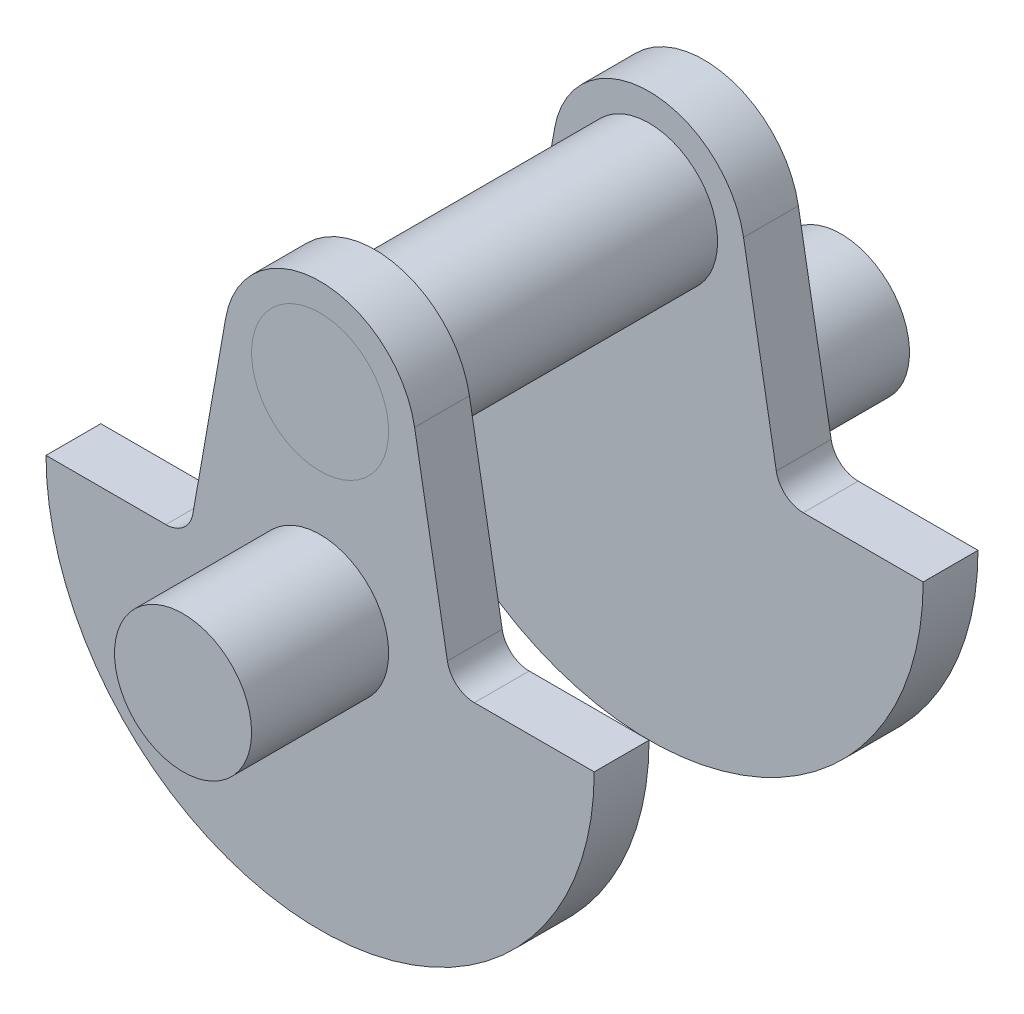
ISO-10303-21;
HEADER;
FILE_DESCRIPTION(('STEP AP214'),'2;1');
FILE_NAME('part.step','',(''),(''),'','','');
FILE_SCHEMA(('AUTOMOTIVE_DESIGN { 1 0 10303 214 1 1 1 1 }'));
ENDSEC;
DATA;
#1=APPLICATION_CONTEXT('core data for automotive mechanical design processes');
#2=APPLICATION_PROTOCOL_DEFINITION('international standard','automotive_design',2000,#1);
#3=PRODUCT_CONTEXT('',#1,'mechanical');
#4=PRODUCT('Part','Part','',(#3));
#5=PRODUCT_RELATED_PRODUCT_CATEGORY('part','',(#4));
#6=PRODUCT_DEFINITION_FORMATION('','',#4);
#7=PRODUCT_DEFINITION_CONTEXT('part definition',#1,'design');
#8=PRODUCT_DEFINITION('design','',#6,#7);
#9=PRODUCT_DEFINITION_SHAPE('','',#8);
#10=(LENGTH_UNIT() NAMED_UNIT(*) SI_UNIT(.MILLI.,.METRE.));
#11=(NAMED_UNIT(*) PLANE_ANGLE_UNIT() SI_UNIT($,.RADIAN.));
#12=(NAMED_UNIT(*) SI_UNIT($,.STERADIAN.) SOLID_ANGLE_UNIT());
#13=UNCERTAINTY_MEASURE_WITH_UNIT(LENGTH_MEASURE(1.E-05),#10,'distance_accuracy_value','');
#14=(GEOMETRIC_REPRESENTATION_CONTEXT(3) GLOBAL_UNCERTAINTY_ASSIGNED_CONTEXT((#13)) GLOBAL_UNIT_ASSIGNED_CONTEXT((#10,
#11,#12)) REPRESENTATION_CONTEXT('',''));
#15=CARTESIAN_POINT('',(0.,0.,0.));
#16=DIRECTION('',(0.,0.,1.));
#17=DIRECTION('',(1.,0.,0.));
#18=AXIS2_PLACEMENT_3D('',#15,#16,#17);
#19=CARTESIAN_POINT('',(0.,35.,10.));
#20=DIRECTION('',(0.,0.,-1.));
#21=DIRECTION('',(-1.,0.,0.));
#22=AXIS2_PLACEMENT_3D('',#19,#20,#21);
#23=CYLINDRICAL_SURFACE('',#22,12.5);
#24=CARTESIAN_POINT('',(0.,35.,10.));
#25=DIRECTION('',(0.,0.,1.));
#26=DIRECTION('',(1.,0.,0.));
#27=AXIS2_PLACEMENT_3D('',#24,#25,#26);
#28=CIRCLE('',#27,12.5);
#29=CARTESIAN_POINT('',(12.5,35.,10.));
#30=VERTEX_POINT('',#29);
#31=EDGE_CURVE('E12',#30,#30,#28,.T.);
#32=ORIENTED_EDGE('',*,*,#31,.F.);
#33=EDGE_LOOP('',(#32));
#34=FACE_BOUND('',#33,.T.);
#35=CARTESIAN_POINT('',(0.,35.,-50.));
#36=DIRECTION('',(0.,0.,1.));
#37=DIRECTION('',(1.,0.,0.));
#38=AXIS2_PLACEMENT_3D('',#35,#36,#37);
#39=CIRCLE('',#38,12.5);
#40=CARTESIAN_POINT('',(12.5,35.,-50.));
#41=VERTEX_POINT('',#40);
#42=EDGE_CURVE('E60',#41,#41,#39,.T.);
#43=ORIENTED_EDGE('',*,*,#42,.T.);
#44=EDGE_LOOP('',(#43));
#45=FACE_BOUND('',#44,.T.);
#46=ADVANCED_FACE('F51',(#34,#45),#23,.T.);
#47=CARTESIAN_POINT('',(0.,0.,10.));
#48=DIRECTION('',(0.,0.,1.));
#49=DIRECTION('',(1.,0.,0.));
#50=AXIS2_PLACEMENT_3D('',#47,#48,#49);
#51=PLANE('',#50);
#52=ORIENTED_EDGE('',*,*,#31,.T.);
#53=EDGE_LOOP('',(#52));
#54=FACE_BOUND('',#53,.T.);
#55=ADVANCED_FACE('F216',(#54),#51,.T.);
#56=CARTESIAN_POINT('',(-28.1369081886832,5.,-60.));
#57=DIRECTION('',(0.,0.,1.));
#58=DIRECTION('',(1.,0.,0.));
#59=AXIS2_PLACEMENT_3D('',#56,#57,#58);
#60=CYLINDRICAL_SURFACE('',#59,5.);
#61=CARTESIAN_POINT('',(-28.1369081886832,5.,-50.));
#62=DIRECTION('',(0.,0.,-1.));
#63=DIRECTION('',(-1.,0.,0.));
#64=AXIS2_PLACEMENT_3D('',#61,#62,#63);
#65=CIRCLE('',#64,5.);
#66=CARTESIAN_POINT('',(-23.2128694236222,4.13175911166538,-50.));
#67=VERTEX_POINT('',#66);
#68=CARTESIAN_POINT('',(-28.1369081886833,0.,-50.));
#69=VERTEX_POINT('',#68);
#70=EDGE_CURVE('E155',#67,#69,#65,.T.);
#71=ORIENTED_EDGE('',*,*,#70,.F.);
#72=DIRECTION('',(0.,0.,1.));
#73=VECTOR('',#72,1.);
#74=CARTESIAN_POINT('',(-23.2128694236222,4.13175911166538,-60.));
#75=LINE('',#74,#73);
#76=CARTESIAN_POINT('',(-23.2128694236222,4.13175911166538,-60.));
#77=VERTEX_POINT('',#76);
#78=EDGE_CURVE('E109',#77,#67,#75,.T.);
#79=ORIENTED_EDGE('',*,*,#78,.F.);
#80=CARTESIAN_POINT('',(-28.1369081886832,5.,-60.));
#81=DIRECTION('',(0.,0.,-1.));
#82=DIRECTION('',(-1.,0.,0.));
#83=AXIS2_PLACEMENT_3D('',#80,#81,#82);
#84=CIRCLE('',#83,5.);
#85=CARTESIAN_POINT('',(-28.1369081886833,0.,-60.));
#86=VERTEX_POINT('',#85);
#87=EDGE_CURVE('E181',#77,#86,#84,.T.);
#88=ORIENTED_EDGE('',*,*,#87,.T.);
#89=DIRECTION('',(0.,0.,1.));
#90=VECTOR('',#89,1.);
#91=CARTESIAN_POINT('',(-28.1369081886833,0.,-60.));
#92=LINE('',#91,#90);
#93=EDGE_CURVE('E104',#86,#69,#92,.T.);
#94=ORIENTED_EDGE('',*,*,#93,.T.);
#95=EDGE_LOOP('',(#71,#79,#88,#94));
#96=FACE_BOUND('',#95,.T.);
#97=ADVANCED_FACE('F213',(#96),#60,.F.);
#98=CARTESIAN_POINT('',(-23.2194881859129,4.0942222454179,-60.));
#99=DIRECTION('',(0.984807753012208,-0.173648177666931,0.));
#100=DIRECTION('',(0.173648177666931,0.984807753012208,0.));
#101=AXIS2_PLACEMENT_3D('',#98,#99,#100);
#102=PLANE('',#101);
#103=DIRECTION('',(0.173648177666931,0.984807753012208,0.));
#104=VECTOR('',#103,1.);
#105=CARTESIAN_POINT('',(-23.2194881859129,4.0942222454179,-50.));
#106=LINE('',#105,#104);
#107=CARTESIAN_POINT('',(-17.2341356777136,38.0388431091713,-50.));
#108=VERTEX_POINT('',#107);
#109=EDGE_CURVE('E159',#67,#108,#106,.T.);
#110=ORIENTED_EDGE('',*,*,#109,.T.);
#111=DIRECTION('',(0.,0.,1.));
#112=VECTOR('',#111,1.);
#113=CARTESIAN_POINT('',(-17.2341356777136,38.0388431091713,-60.));
#114=LINE('',#113,#112);
#115=CARTESIAN_POINT('',(-17.2341356777136,38.0388431091713,-60.));
#116=VERTEX_POINT('',#115);
#117=EDGE_CURVE('E195',#116,#108,#114,.T.);
#118=ORIENTED_EDGE('',*,*,#117,.F.);
#119=DIRECTION('',(0.173648177666931,0.984807753012208,0.));
#120=VECTOR('',#119,1.);
#121=CARTESIAN_POINT('',(-23.2194881859129,4.0942222454179,-60.));
#122=LINE('',#121,#120);
#123=EDGE_CURVE('E346',#77,#116,#122,.T.);
#124=ORIENTED_EDGE('',*,*,#123,.F.);
#125=ORIENTED_EDGE('',*,*,#78,.T.);
#126=EDGE_LOOP('',(#110,#118,#124,#125));
#127=FACE_BOUND('',#126,.T.);
#128=ADVANCED_FACE('F215',(#127),#102,.F.);
#129=CARTESIAN_POINT('',(0.,35.,-60.));
#130=DIRECTION('',(0.,0.,1.));
#131=DIRECTION('',(1.,0.,0.));
#132=AXIS2_PLACEMENT_3D('',#129,#130,#131);
#133=CYLINDRICAL_SURFACE('',#132,17.5);
#134=CARTESIAN_POINT('',(0.,35.,-50.));
#135=DIRECTION('',(0.,0.,-1.));
#136=DIRECTION('',(-1.,0.,0.));
#137=AXIS2_PLACEMENT_3D('',#134,#135,#136);
#138=CIRCLE('',#137,17.5);
#139=CARTESIAN_POINT('',(17.2341356777136,38.0388431091713,-50.));
#140=VERTEX_POINT('',#139);
#141=EDGE_CURVE('E163',#108,#140,#138,.T.);
#142=ORIENTED_EDGE('',*,*,#141,.T.);
#143=DIRECTION('',(0.,0.,1.));
#144=VECTOR('',#143,1.);
#145=CARTESIAN_POINT('',(17.2341356777136,38.0388431091713,-60.));
#146=LINE('',#145,#144);
#147=CARTESIAN_POINT('',(17.2341356777136,38.0388431091713,-60.));
#148=VERTEX_POINT('',#147);
#149=EDGE_CURVE('E191',#148,#140,#146,.T.);
#150=ORIENTED_EDGE('',*,*,#149,.F.);
#151=CARTESIAN_POINT('',(0.,35.,-60.));
#152=DIRECTION('',(0.,0.,-1.));
#153=DIRECTION('',(-1.,0.,0.));
#154=AXIS2_PLACEMENT_3D('',#151,#152,#153);
#155=CIRCLE('',#154,17.5);
#156=EDGE_CURVE('E349',#116,#148,#155,.T.);
#157=ORIENTED_EDGE('',*,*,#156,.F.);
#158=ORIENTED_EDGE('',*,*,#117,.T.);
#159=EDGE_LOOP('',(#142,#150,#157,#158));
#160=FACE_BOUND('',#159,.T.);
#161=ADVANCED_FACE('F222',(#160),#133,.T.);
#162=CARTESIAN_POINT('',(23.2194881859129,4.0942222454179,-60.));
#163=DIRECTION('',(-0.984807753012208,-0.173648177666931,0.));
#164=DIRECTION('',(0.173648177666931,-0.984807753012208,0.));
#165=AXIS2_PLACEMENT_3D('',#162,#163,#164);
#166=PLANE('',#165);
#167=DIRECTION('',(0.173648177666931,-0.984807753012208,0.));
#168=VECTOR('',#167,1.);
#169=CARTESIAN_POINT('',(23.2194881859129,4.0942222454179,-50.));
#170=LINE('',#169,#168);
#171=CARTESIAN_POINT('',(23.2128694236222,4.13175911166537,-50.));
#172=VERTEX_POINT('',#171);
#173=EDGE_CURVE('E166',#140,#172,#170,.T.);
#174=ORIENTED_EDGE('',*,*,#173,.T.);
#175=DIRECTION('',(0.,0.,1.));
#176=VECTOR('',#175,1.);
#177=CARTESIAN_POINT('',(23.2128694236222,4.13175911166537,-60.));
#178=LINE('',#177,#176);
#179=CARTESIAN_POINT('',(23.2128694236222,4.13175911166537,-60.));
#180=VERTEX_POINT('',#179);
#181=EDGE_CURVE('E188',#180,#172,#178,.T.);
#182=ORIENTED_EDGE('',*,*,#181,.F.);
#183=DIRECTION('',(0.173648177666931,-0.984807753012208,0.));
#184=VECTOR('',#183,1.);
#185=CARTESIAN_POINT('',(23.2194881859129,4.0942222454179,-60.));
#186=LINE('',#185,#184);
#187=EDGE_CURVE('E352',#148,#180,#186,.T.);
#188=ORIENTED_EDGE('',*,*,#187,.F.);
#189=ORIENTED_EDGE('',*,*,#149,.T.);
#190=EDGE_LOOP('',(#174,#182,#188,#189));
#191=FACE_BOUND('',#190,.T.);
#192=ADVANCED_FACE('F254',(#191),#166,.F.);
#193=CARTESIAN_POINT('',(28.1369081886832,5.,-60.));
#194=DIRECTION('',(0.,0.,1.));
#195=DIRECTION('',(1.,0.,0.));
#196=AXIS2_PLACEMENT_3D('',#193,#194,#195);
#197=CYLINDRICAL_SURFACE('',#196,5.);
#198=CARTESIAN_POINT('',(28.1369081886832,5.,-50.));
#199=DIRECTION('',(0.,0.,-1.));
#200=DIRECTION('',(-1.,0.,0.));
#201=AXIS2_PLACEMENT_3D('',#198,#199,#200);
#202=CIRCLE('',#201,5.);
#203=CARTESIAN_POINT('',(28.1369081886833,0.,-50.));
#204=VERTEX_POINT('',#203);
#205=EDGE_CURVE('E170',#204,#172,#202,.T.);
#206=ORIENTED_EDGE('',*,*,#205,.F.);
#207=DIRECTION('',(0.,0.,1.));
#208=VECTOR('',#207,1.);
#209=CARTESIAN_POINT('',(28.1369081886833,0.,-60.));
#210=LINE('',#209,#208);
#211=CARTESIAN_POINT('',(28.1369081886833,0.,-60.));
#212=VERTEX_POINT('',#211);
#213=EDGE_CURVE('E141',#212,#204,#210,.T.);
#214=ORIENTED_EDGE('',*,*,#213,.F.);
#215=CARTESIAN_POINT('',(28.1369081886832,5.,-60.));
#216=DIRECTION('',(0.,0.,-1.));
#217=DIRECTION('',(-1.,0.,0.));
#218=AXIS2_PLACEMENT_3D('',#215,#216,#217);
#219=CIRCLE('',#218,5.);
#220=EDGE_CURVE('E132',#212,#180,#219,.T.);
#221=ORIENTED_EDGE('',*,*,#220,.T.);
#222=ORIENTED_EDGE('',*,*,#181,.T.);
#223=EDGE_LOOP('',(#206,#214,#221,#222));
#224=FACE_BOUND('',#223,.T.);
#225=ADVANCED_FACE('F264',(#224),#197,.F.);
#226=CARTESIAN_POINT('',(0.,0.,-60.));
#227=DIRECTION('',(0.,-1.,0.));
#228=DIRECTION('',(0.,0.,-1.));
#229=AXIS2_PLACEMENT_3D('',#226,#227,#228);
#230=PLANE('',#229);
#231=DIRECTION('',(1.,0.,0.));
#232=VECTOR('',#231,1.);
#233=CARTESIAN_POINT('',(0.,0.,-50.));
#234=LINE('',#233,#232);
#235=CARTESIAN_POINT('',(50.,0.,-50.));
#236=VERTEX_POINT('',#235);
#237=EDGE_CURVE('E139',#204,#236,#234,.T.);
#238=ORIENTED_EDGE('',*,*,#237,.T.);
#239=DIRECTION('',(0.,0.,1.));
#240=VECTOR('',#239,1.);
#241=CARTESIAN_POINT('',(50.,0.,-60.));
#242=LINE('',#241,#240);
#243=CARTESIAN_POINT('',(50.,0.,-60.));
#244=VERTEX_POINT('',#243);
#245=EDGE_CURVE('E136',#244,#236,#242,.T.);
#246=ORIENTED_EDGE('',*,*,#245,.F.);
#247=DIRECTION('',(1.,0.,0.));
#248=VECTOR('',#247,1.);
#249=CARTESIAN_POINT('',(0.,0.,-60.));
#250=LINE('',#249,#248);
#251=EDGE_CURVE('E125',#212,#244,#250,.T.);
#252=ORIENTED_EDGE('',*,*,#251,.F.);
#253=ORIENTED_EDGE('',*,*,#213,.T.);
#254=EDGE_LOOP('',(#238,#246,#252,#253));
#255=FACE_BOUND('',#254,.T.);
#256=ADVANCED_FACE('F137',(#255),#230,.F.);
#257=CARTESIAN_POINT('',(0.,0.,-60.));
#258=DIRECTION('',(0.,0.,1.));
#259=DIRECTION('',(1.,0.,0.));
#260=AXIS2_PLACEMENT_3D('',#257,#258,#259);
#261=CYLINDRICAL_SURFACE('',#260,50.);
#262=CARTESIAN_POINT('',(0.,0.,-50.));
#263=DIRECTION('',(0.,0.,-1.));
#264=DIRECTION('',(-1.,0.,0.));
#265=AXIS2_PLACEMENT_3D('',#262,#263,#264);
#266=CIRCLE('',#265,50.);
#267=CARTESIAN_POINT('',(-50.,0.,-50.));
#268=VERTEX_POINT('',#267);
#269=EDGE_CURVE('E97',#236,#268,#266,.T.);
#270=ORIENTED_EDGE('',*,*,#269,.T.);
#271=DIRECTION('',(0.,0.,1.));
#272=VECTOR('',#271,1.);
#273=CARTESIAN_POINT('',(-50.,0.,-60.));
#274=LINE('',#273,#272);
#275=CARTESIAN_POINT('',(-50.,0.,-60.));
#276=VERTEX_POINT('',#275);
#277=EDGE_CURVE('E142',#276,#268,#274,.T.);
#278=ORIENTED_EDGE('',*,*,#277,.F.);
#279=CARTESIAN_POINT('',(0.,0.,-60.));
#280=DIRECTION('',(0.,0.,-1.));
#281=DIRECTION('',(-1.,0.,0.));
#282=AXIS2_PLACEMENT_3D('',#279,#280,#281);
#283=CIRCLE('',#282,50.);
#284=EDGE_CURVE('E130',#244,#276,#283,.T.);
#285=ORIENTED_EDGE('',*,*,#284,.F.);
#286=ORIENTED_EDGE('',*,*,#245,.T.);
#287=EDGE_LOOP('',(#270,#278,#285,#286));
#288=FACE_BOUND('',#287,.T.);
#289=ADVANCED_FACE('F144',(#288),#261,.T.);
#290=CARTESIAN_POINT('',(0.,0.,-60.));
#291=DIRECTION('',(0.,-1.,0.));
#292=DIRECTION('',(1.,0.,0.));
#293=AXIS2_PLACEMENT_3D('',#290,#291,#292);
#294=PLANE('',#293);
#295=DIRECTION('',(1.,0.,0.));
#296=VECTOR('',#295,1.);
#297=CARTESIAN_POINT('',(0.,0.,-50.));
#298=LINE('',#297,#296);
#299=EDGE_CURVE('E178',#268,#69,#298,.T.);
#300=ORIENTED_EDGE('',*,*,#299,.T.);
#301=ORIENTED_EDGE('',*,*,#93,.F.);
#302=DIRECTION('',(1.,0.,0.));
#303=VECTOR('',#302,1.);
#304=CARTESIAN_POINT('',(0.,0.,-60.));
#305=LINE('',#304,#303);
#306=EDGE_CURVE('E68',#276,#86,#305,.T.);
#307=ORIENTED_EDGE('',*,*,#306,.F.);
#308=ORIENTED_EDGE('',*,*,#277,.T.);
#309=EDGE_LOOP('',(#300,#301,#307,#308));
#310=FACE_BOUND('',#309,.T.);
#311=ADVANCED_FACE('F291',(#310),#294,.F.);
#312=CARTESIAN_POINT('',(0.,0.,-60.));
#313=DIRECTION('',(0.,0.,-1.));
#314=DIRECTION('',(-1.,0.,0.));
#315=AXIS2_PLACEMENT_3D('',#312,#313,#314);
#316=PLANE('',#315);
#317=ORIENTED_EDGE('',*,*,#87,.F.);
#318=ORIENTED_EDGE('',*,*,#123,.T.);
#319=ORIENTED_EDGE('',*,*,#156,.T.);
#320=ORIENTED_EDGE('',*,*,#187,.T.);
#321=ORIENTED_EDGE('',*,*,#220,.F.);
#322=ORIENTED_EDGE('',*,*,#251,.T.);
#323=ORIENTED_EDGE('',*,*,#284,.T.);
#324=ORIENTED_EDGE('',*,*,#306,.T.);
#325=EDGE_LOOP('',(#317,#318,#319,#320,#321,#322,#323,#324));
#326=FACE_BOUND('',#325,.T.);
#327=CARTESIAN_POINT('',(0.,0.,-60.));
#328=DIRECTION('',(0.,0.,-1.));
#329=DIRECTION('',(-1.,0.,0.));
#330=AXIS2_PLACEMENT_3D('',#327,#328,#329);
#331=CIRCLE('',#330,12.5);
#332=CARTESIAN_POINT('',(-12.5,0.,-60.));
#333=VERTEX_POINT('',#332);
#334=EDGE_CURVE('E148',#333,#333,#331,.T.);
#335=ORIENTED_EDGE('',*,*,#334,.F.);
#336=EDGE_LOOP('',(#335));
#337=FACE_BOUND('',#336,.T.);
#338=ADVANCED_FACE('F127',(#326,#337),#316,.T.);
#339=CARTESIAN_POINT('',(0.,0.,-50.));
#340=DIRECTION('',(0.,0.,-1.));
#341=DIRECTION('',(-1.,0.,0.));
#342=AXIS2_PLACEMENT_3D('',#339,#340,#341);
#343=PLANE('',#342);
#344=ORIENTED_EDGE('',*,*,#42,.F.);
#345=EDGE_LOOP('',(#344));
#346=FACE_BOUND('',#345,.T.);
#347=ORIENTED_EDGE('',*,*,#70,.T.);
#348=ORIENTED_EDGE('',*,*,#299,.F.);
#349=ORIENTED_EDGE('',*,*,#269,.F.);
#350=ORIENTED_EDGE('',*,*,#237,.F.);
#351=ORIENTED_EDGE('',*,*,#205,.T.);
#352=ORIENTED_EDGE('',*,*,#173,.F.);
#353=ORIENTED_EDGE('',*,*,#141,.F.);
#354=ORIENTED_EDGE('',*,*,#109,.F.);
#355=EDGE_LOOP('',(#347,#348,#349,#350,#351,#352,#353,#354));
#356=FACE_BOUND('',#355,.T.);
#357=ADVANCED_FACE('F205',(#346,#356),#343,.F.);
#358=CARTESIAN_POINT('',(0.,0.,-85.));
#359=DIRECTION('',(0.,0.,1.));
#360=DIRECTION('',(1.,0.,0.));
#361=AXIS2_PLACEMENT_3D('',#358,#359,#360);
#362=CYLINDRICAL_SURFACE('',#361,12.5);
#363=ORIENTED_EDGE('',*,*,#334,.T.);
#364=EDGE_LOOP('',(#363));
#365=FACE_BOUND('',#364,.T.);
#366=CARTESIAN_POINT('',(0.,0.,-85.));
#367=DIRECTION('',(0.,0.,-1.));
#368=DIRECTION('',(-1.,0.,0.));
#369=AXIS2_PLACEMENT_3D('',#366,#367,#368);
#370=CIRCLE('',#369,12.5);
#371=CARTESIAN_POINT('',(-12.5,0.,-85.));
#372=VERTEX_POINT('',#371);
#373=EDGE_CURVE('E160',#372,#372,#370,.T.);
#374=ORIENTED_EDGE('',*,*,#373,.F.);
#375=EDGE_LOOP('',(#374));
#376=FACE_BOUND('',#375,.T.);
#377=ADVANCED_FACE('F208',(#365,#376),#362,.T.);
#378=CARTESIAN_POINT('',(0.,0.,-85.));
#379=DIRECTION('',(0.,0.,-1.));
#380=DIRECTION('',(-1.,0.,0.));
#381=AXIS2_PLACEMENT_3D('',#378,#379,#380);
#382=PLANE('',#381);
#383=ORIENTED_EDGE('',*,*,#373,.T.);
#384=EDGE_LOOP('',(#383));
#385=FACE_BOUND('',#384,.T.);
#386=ADVANCED_FACE('F324',(#385),#382,.T.);
#387=CLOSED_SHELL('',(#46,#55,#97,#128,#161,#192,#225,#256,#289,#311,#338,#357,#377,#386));
#388=MANIFOLD_SOLID_BREP('B2',#387);
#389=CARTESIAN_POINT('',(0.,0.,10.));
#390=DIRECTION('',(0.,0.,1.));
#391=DIRECTION('',(1.,0.,0.));
#392=AXIS2_PLACEMENT_3D('',#389,#390,#391);
#393=PLANE('',#392);
#394=CARTESIAN_POINT('',(0.,0.,10.));
#395=DIRECTION('',(0.,0.,1.));
#396=DIRECTION('',(1.,0.,0.));
#397=AXIS2_PLACEMENT_3D('',#394,#395,#396);
#398=CIRCLE('',#397,12.5);
#399=CARTESIAN_POINT('',(12.5,0.,10.));
#400=VERTEX_POINT('',#399);
#401=EDGE_CURVE('E471',#400,#400,#398,.T.);
#402=ORIENTED_EDGE('',*,*,#401,.F.);
#403=EDGE_LOOP('',(#402));
#404=FACE_BOUND('',#403,.T.);
#405=CARTESIAN_POINT('',(0.,0.,10.));
#406=DIRECTION('',(0.,0.,1.));
#407=DIRECTION('',(1.,0.,0.));
#408=AXIS2_PLACEMENT_3D('',#405,#406,#407);
#409=CIRCLE('',#408,50.);
#410=CARTESIAN_POINT('',(-50.,0.,10.));
#411=VERTEX_POINT('',#410);
#412=CARTESIAN_POINT('',(50.,0.,10.));
#413=VERTEX_POINT('',#412);
#414=EDGE_CURVE('E482',#411,#413,#409,.T.);
#415=ORIENTED_EDGE('',*,*,#414,.T.);
#416=DIRECTION('',(-1.,0.,0.));
#417=VECTOR('',#416,1.);
#418=CARTESIAN_POINT('',(50.,0.,10.));
#419=LINE('',#418,#417);
#420=CARTESIAN_POINT('',(28.1369081886833,0.,10.));
#421=VERTEX_POINT('',#420);
#422=EDGE_CURVE('E430',#413,#421,#419,.T.);
#423=ORIENTED_EDGE('',*,*,#422,.T.);
#424=CARTESIAN_POINT('',(28.1369081886832,5.,10.));
#425=DIRECTION('',(0.,0.,-1.));
#426=DIRECTION('',(-1.,0.,0.));
#427=AXIS2_PLACEMENT_3D('',#424,#425,#426);
#428=CIRCLE('',#427,5.);
#429=CARTESIAN_POINT('',(23.2128694236222,4.13175911166537,10.));
#430=VERTEX_POINT('',#429);
#431=EDGE_CURVE('E497',#421,#430,#428,.T.);
#432=ORIENTED_EDGE('',*,*,#431,.T.);
#433=DIRECTION('',(-0.173648177666931,0.984807753012208,0.));
#434=VECTOR('',#433,1.);
#435=CARTESIAN_POINT('',(23.2128694236222,4.13175911166537,10.));
#436=LINE('',#435,#434);
#437=CARTESIAN_POINT('',(17.2341356777136,38.0388431091713,10.));
#438=VERTEX_POINT('',#437);
#439=EDGE_CURVE('E510',#430,#438,#436,.T.);
#440=ORIENTED_EDGE('',*,*,#439,.T.);
#441=CARTESIAN_POINT('',(0.,35.,10.));
#442=DIRECTION('',(0.,0.,1.));
#443=DIRECTION('',(1.,0.,0.));
#444=AXIS2_PLACEMENT_3D('',#441,#442,#443);
#445=CIRCLE('',#444,17.5);
#446=CARTESIAN_POINT('',(-17.2341356777136,38.0388431091713,10.));
#447=VERTEX_POINT('',#446);
#448=EDGE_CURVE('E449',#438,#447,#445,.T.);
#449=ORIENTED_EDGE('',*,*,#448,.T.);
#450=DIRECTION('',(-0.173648177666931,-0.984807753012208,0.));
#451=VECTOR('',#450,1.);
#452=CARTESIAN_POINT('',(-23.2128694236222,4.13175911166537,10.));
#453=LINE('',#452,#451);
#454=CARTESIAN_POINT('',(-23.2128694236222,4.13175911166537,10.));
#455=VERTEX_POINT('',#454);
#456=EDGE_CURVE('E443',#447,#455,#453,.T.);
#457=ORIENTED_EDGE('',*,*,#456,.T.);
#458=CARTESIAN_POINT('',(-28.1369081886832,5.,10.));
#459=DIRECTION('',(0.,0.,-1.));
#460=DIRECTION('',(1.,0.,0.));
#461=AXIS2_PLACEMENT_3D('',#458,#459,#460);
#462=CIRCLE('',#461,5.);
#463=CARTESIAN_POINT('',(-28.1369081886833,0.,10.));
#464=VERTEX_POINT('',#463);
#465=EDGE_CURVE('E447',#455,#464,#462,.T.);
#466=ORIENTED_EDGE('',*,*,#465,.T.);
#467=DIRECTION('',(-1.,0.,0.));
#468=VECTOR('',#467,1.);
#469=CARTESIAN_POINT('',(-50.,0.,10.));
#470=LINE('',#469,#468);
#471=EDGE_CURVE('E387',#464,#411,#470,.T.);
#472=ORIENTED_EDGE('',*,*,#471,.T.);
#473=EDGE_LOOP('',(#415,#423,#432,#440,#449,#457,#466,#472));
#474=FACE_BOUND('',#473,.T.);
#475=CARTESIAN_POINT('',(0.,35.,10.));
#476=DIRECTION('',(0.,0.,1.));
#477=DIRECTION('',(1.,0.,0.));
#478=AXIS2_PLACEMENT_3D('',#475,#476,#477);
#479=CIRCLE('',#478,12.5);
#480=CARTESIAN_POINT('',(12.5,35.,10.));
#481=VERTEX_POINT('',#480);
#482=EDGE_CURVE('E518',#481,#481,#479,.T.);
#483=ORIENTED_EDGE('',*,*,#482,.F.);
#484=EDGE_LOOP('',(#483));
#485=FACE_BOUND('',#484,.T.);
#486=ADVANCED_FACE('F370',(#404,#474,#485),#393,.T.);
#487=CARTESIAN_POINT('',(0.,0.,0.));
#488=DIRECTION('',(0.,0.,1.));
#489=DIRECTION('',(1.,0.,0.));
#490=AXIS2_PLACEMENT_3D('',#487,#488,#489);
#491=PLANE('',#490);
#492=CARTESIAN_POINT('',(0.,0.,0.));
#493=DIRECTION('',(0.,0.,1.));
#494=DIRECTION('',(1.,0.,0.));
#495=AXIS2_PLACEMENT_3D('',#492,#493,#494);
#496=CIRCLE('',#495,50.);
#497=CARTESIAN_POINT('',(-50.,0.,0.));
#498=VERTEX_POINT('',#497);
#499=CARTESIAN_POINT('',(50.,0.,0.));
#500=VERTEX_POINT('',#499);
#501=EDGE_CURVE('E467',#498,#500,#496,.T.);
#502=ORIENTED_EDGE('',*,*,#501,.F.);
#503=DIRECTION('',(-1.,0.,0.));
#504=VECTOR('',#503,1.);
#505=CARTESIAN_POINT('',(-50.,0.,0.));
#506=LINE('',#505,#504);
#507=CARTESIAN_POINT('',(-28.1369081886833,0.,0.));
#508=VERTEX_POINT('',#507);
#509=EDGE_CURVE('E422',#508,#498,#506,.T.);
#510=ORIENTED_EDGE('',*,*,#509,.F.);
#511=CARTESIAN_POINT('',(-28.1369081886832,5.,0.));
#512=DIRECTION('',(0.,0.,-1.));
#513=DIRECTION('',(1.,0.,0.));
#514=AXIS2_PLACEMENT_3D('',#511,#512,#513);
#515=CIRCLE('',#514,5.);
#516=CARTESIAN_POINT('',(-23.2128694236222,4.13175911166537,0.));
#517=VERTEX_POINT('',#516);
#518=EDGE_CURVE('E416',#517,#508,#515,.T.);
#519=ORIENTED_EDGE('',*,*,#518,.F.);
#520=DIRECTION('',(-0.173648177666931,-0.984807753012208,0.));
#521=VECTOR('',#520,1.);
#522=CARTESIAN_POINT('',(-23.2128694236222,4.13175911166537,0.));
#523=LINE('',#522,#521);
#524=CARTESIAN_POINT('',(-17.2341356777136,38.0388431091713,0.));
#525=VERTEX_POINT('',#524);
#526=EDGE_CURVE('E457',#525,#517,#523,.T.);
#527=ORIENTED_EDGE('',*,*,#526,.F.);
#528=CARTESIAN_POINT('',(0.,35.,0.));
#529=DIRECTION('',(0.,0.,1.));
#530=DIRECTION('',(1.,0.,0.));
#531=AXIS2_PLACEMENT_3D('',#528,#529,#530);
#532=CIRCLE('',#531,17.5);
#533=CARTESIAN_POINT('',(17.2341356777136,38.0388431091713,0.));
#534=VERTEX_POINT('',#533);
#535=EDGE_CURVE('E477',#534,#525,#532,.T.);
#536=ORIENTED_EDGE('',*,*,#535,.F.);
#537=DIRECTION('',(-0.173648177666931,0.984807753012208,0.));
#538=VECTOR('',#537,1.);
#539=CARTESIAN_POINT('',(23.2128694236222,4.13175911166537,0.));
#540=LINE('',#539,#538);
#541=CARTESIAN_POINT('',(23.2128694236222,4.13175911166537,0.));
#542=VERTEX_POINT('',#541);
#543=EDGE_CURVE('E475',#542,#534,#540,.T.);
#544=ORIENTED_EDGE('',*,*,#543,.F.);
#545=CARTESIAN_POINT('',(28.1369081886832,5.,0.));
#546=DIRECTION('',(0.,0.,-1.));
#547=DIRECTION('',(-1.,0.,0.));
#548=AXIS2_PLACEMENT_3D('',#545,#546,#547);
#549=CIRCLE('',#548,5.);
#550=CARTESIAN_POINT('',(28.1369081886833,0.,0.));
#551=VERTEX_POINT('',#550);
#552=EDGE_CURVE('E473',#551,#542,#549,.T.);
#553=ORIENTED_EDGE('',*,*,#552,.F.);
#554=DIRECTION('',(-1.,0.,0.));
#555=VECTOR('',#554,1.);
#556=CARTESIAN_POINT('',(50.,0.,0.));
#557=LINE('',#556,#555);
#558=EDGE_CURVE('E470',#500,#551,#557,.T.);
#559=ORIENTED_EDGE('',*,*,#558,.F.);
#560=EDGE_LOOP('',(#502,#510,#519,#527,#536,#544,#553,#559));
#561=FACE_BOUND('',#560,.T.);
#562=CARTESIAN_POINT('',(0.,35.,0.));
#563=DIRECTION('',(0.,0.,1.));
#564=DIRECTION('',(1.,0.,0.));
#565=AXIS2_PLACEMENT_3D('',#562,#563,#564);
#566=CIRCLE('',#565,12.5);
#567=CARTESIAN_POINT('',(12.5,35.,0.));
#568=VERTEX_POINT('',#567);
#569=EDGE_CURVE('E519',#568,#568,#566,.T.);
#570=ORIENTED_EDGE('',*,*,#569,.T.);
#571=EDGE_LOOP('',(#570));
#572=FACE_BOUND('',#571,.T.);
#573=ADVANCED_FACE('F501',(#561,#572),#491,.F.);
#574=CARTESIAN_POINT('',(0.,0.,10.));
#575=DIRECTION('',(0.,0.,-1.));
#576=DIRECTION('',(-1.,0.,0.));
#577=AXIS2_PLACEMENT_3D('',#574,#575,#576);
#578=CYLINDRICAL_SURFACE('',#577,50.);
#579=ORIENTED_EDGE('',*,*,#501,.T.);
#580=DIRECTION('',(0.,0.,-1.));
#581=VECTOR('',#580,1.);
#582=CARTESIAN_POINT('',(50.,0.,10.));
#583=LINE('',#582,#581);
#584=EDGE_CURVE('E49',#413,#500,#583,.T.);
#585=ORIENTED_EDGE('',*,*,#584,.F.);
#586=ORIENTED_EDGE('',*,*,#414,.F.);
#587=DIRECTION('',(0.,0.,-1.));
#588=VECTOR('',#587,1.);
#589=CARTESIAN_POINT('',(-50.,0.,10.));
#590=LINE('',#589,#588);
#591=EDGE_CURVE('E463',#411,#498,#590,.T.);
#592=ORIENTED_EDGE('',*,*,#591,.T.);
#593=EDGE_LOOP('',(#579,#585,#586,#592));
#594=FACE_BOUND('',#593,.T.);
#595=ADVANCED_FACE('F372',(#594),#578,.T.);
#596=CARTESIAN_POINT('',(50.,0.,10.));
#597=DIRECTION('',(0.,-1.,0.));
#598=DIRECTION('',(1.,0.,0.));
#599=AXIS2_PLACEMENT_3D('',#596,#597,#598);
#600=PLANE('',#599);
#601=ORIENTED_EDGE('',*,*,#558,.T.);
#602=DIRECTION('',(0.,0.,-1.));
#603=VECTOR('',#602,1.);
#604=CARTESIAN_POINT('',(28.1369081886833,0.,10.));
#605=LINE('',#604,#603);
#606=EDGE_CURVE('E379',#421,#551,#605,.T.);
#607=ORIENTED_EDGE('',*,*,#606,.F.);
#608=ORIENTED_EDGE('',*,*,#422,.F.);
#609=ORIENTED_EDGE('',*,*,#584,.T.);
#610=EDGE_LOOP('',(#601,#607,#608,#609));
#611=FACE_BOUND('',#610,.T.);
#612=ADVANCED_FACE('F563',(#611),#600,.F.);
#613=CARTESIAN_POINT('',(28.1369081886832,5.,10.));
#614=DIRECTION('',(0.,0.,-1.));
#615=DIRECTION('',(-1.,0.,0.));
#616=AXIS2_PLACEMENT_3D('',#613,#614,#615);
#617=CYLINDRICAL_SURFACE('',#616,5.);
#618=ORIENTED_EDGE('',*,*,#552,.T.);
#619=DIRECTION('',(0.,0.,-1.));
#620=VECTOR('',#619,1.);
#621=CARTESIAN_POINT('',(23.2128694236222,4.13175911166537,10.));
#622=LINE('',#621,#620);
#623=EDGE_CURVE('E489',#430,#542,#622,.T.);
#624=ORIENTED_EDGE('',*,*,#623,.F.);
#625=ORIENTED_EDGE('',*,*,#431,.F.);
#626=ORIENTED_EDGE('',*,*,#606,.T.);
#627=EDGE_LOOP('',(#618,#624,#625,#626));
#628=FACE_BOUND('',#627,.T.);
#629=ADVANCED_FACE('F495',(#628),#617,.F.);
#630=CARTESIAN_POINT('',(23.2128694236222,4.13175911166537,10.));
#631=DIRECTION('',(-0.984807753012208,-0.173648177666931,0.));
#632=DIRECTION('',(0.173648177666931,-0.984807753012208,0.));
#633=AXIS2_PLACEMENT_3D('',#630,#631,#632);
#634=PLANE('',#633);
#635=ORIENTED_EDGE('',*,*,#543,.T.);
#636=DIRECTION('',(0.,0.,-1.));
#637=VECTOR('',#636,1.);
#638=CARTESIAN_POINT('',(17.2341356777136,38.0388431091713,10.));
#639=LINE('',#638,#637);
#640=EDGE_CURVE('E486',#438,#534,#639,.T.);
#641=ORIENTED_EDGE('',*,*,#640,.F.);
#642=ORIENTED_EDGE('',*,*,#439,.F.);
#643=ORIENTED_EDGE('',*,*,#623,.T.);
#644=EDGE_LOOP('',(#635,#641,#642,#643));
#645=FACE_BOUND('',#644,.T.);
#646=ADVANCED_FACE('F506',(#645),#634,.F.);
#647=CARTESIAN_POINT('',(0.,35.,10.));
#648=DIRECTION('',(0.,0.,-1.));
#649=DIRECTION('',(-1.,0.,0.));
#650=AXIS2_PLACEMENT_3D('',#647,#648,#649);
#651=CYLINDRICAL_SURFACE('',#650,17.5);
#652=ORIENTED_EDGE('',*,*,#535,.T.);
#653=DIRECTION('',(0.,0.,-1.));
#654=VECTOR('',#653,1.);
#655=CARTESIAN_POINT('',(-17.2341356777136,38.0388431091713,10.));
#656=LINE('',#655,#654);
#657=EDGE_CURVE('E458',#447,#525,#656,.T.);
#658=ORIENTED_EDGE('',*,*,#657,.F.);
#659=ORIENTED_EDGE('',*,*,#448,.F.);
#660=ORIENTED_EDGE('',*,*,#640,.T.);
#661=EDGE_LOOP('',(#652,#658,#659,#660));
#662=FACE_BOUND('',#661,.T.);
#663=ADVANCED_FACE('F509',(#662),#651,.T.);
#664=CARTESIAN_POINT('',(-23.2128694236222,4.13175911166537,10.));
#665=DIRECTION('',(0.984807753012208,-0.173648177666931,0.));
#666=DIRECTION('',(0.173648177666931,0.984807753012208,0.));
#667=AXIS2_PLACEMENT_3D('',#664,#665,#666);
#668=PLANE('',#667);
#669=ORIENTED_EDGE('',*,*,#526,.T.);
#670=DIRECTION('',(0.,0.,-1.));
#671=VECTOR('',#670,1.);
#672=CARTESIAN_POINT('',(-23.2128694236222,4.13175911166537,10.));
#673=LINE('',#672,#671);
#674=EDGE_CURVE('E454',#455,#517,#673,.T.);
#675=ORIENTED_EDGE('',*,*,#674,.F.);
#676=ORIENTED_EDGE('',*,*,#456,.F.);
#677=ORIENTED_EDGE('',*,*,#657,.T.);
#678=EDGE_LOOP('',(#669,#675,#676,#677));
#679=FACE_BOUND('',#678,.T.);
#680=ADVANCED_FACE('F455',(#679),#668,.F.);
#681=CARTESIAN_POINT('',(-28.1369081886832,5.,10.));
#682=DIRECTION('',(0.,0.,-1.));
#683=DIRECTION('',(-1.,0.,0.));
#684=AXIS2_PLACEMENT_3D('',#681,#682,#683);
#685=CYLINDRICAL_SURFACE('',#684,5.);
#686=ORIENTED_EDGE('',*,*,#518,.T.);
#687=DIRECTION('',(0.,0.,-1.));
#688=VECTOR('',#687,1.);
#689=CARTESIAN_POINT('',(-28.1369081886833,0.,10.));
#690=LINE('',#689,#688);
#691=EDGE_CURVE('E459',#464,#508,#690,.T.);
#692=ORIENTED_EDGE('',*,*,#691,.F.);
#693=ORIENTED_EDGE('',*,*,#465,.F.);
#694=ORIENTED_EDGE('',*,*,#674,.T.);
#695=EDGE_LOOP('',(#686,#692,#693,#694));
#696=FACE_BOUND('',#695,.T.);
#697=ADVANCED_FACE('F461',(#696),#685,.F.);
#698=CARTESIAN_POINT('',(-50.,0.,10.));
#699=DIRECTION('',(0.,-1.,0.));
#700=DIRECTION('',(1.,0.,0.));
#701=AXIS2_PLACEMENT_3D('',#698,#699,#700);
#702=PLANE('',#701);
#703=ORIENTED_EDGE('',*,*,#509,.T.);
#704=ORIENTED_EDGE('',*,*,#591,.F.);
#705=ORIENTED_EDGE('',*,*,#471,.F.);
#706=ORIENTED_EDGE('',*,*,#691,.T.);
#707=EDGE_LOOP('',(#703,#704,#705,#706));
#708=FACE_BOUND('',#707,.T.);
#709=ADVANCED_FACE('F540',(#708),#702,.F.);
#710=CARTESIAN_POINT('',(0.,35.,10.));
#711=DIRECTION('',(0.,0.,-1.));
#712=DIRECTION('',(-1.,0.,0.));
#713=AXIS2_PLACEMENT_3D('',#710,#711,#712);
#714=CYLINDRICAL_SURFACE('',#713,12.5);
#715=ORIENTED_EDGE('',*,*,#482,.T.);
#716=EDGE_LOOP('',(#715));
#717=FACE_BOUND('',#716,.T.);
#718=ORIENTED_EDGE('',*,*,#569,.F.);
#719=EDGE_LOOP('',(#718));
#720=FACE_BOUND('',#719,.T.);
#721=ADVANCED_FACE('F532',(#717,#720),#714,.F.);
#722=CARTESIAN_POINT('',(0.,0.,35.));
#723=DIRECTION('',(0.,0.,-1.));
#724=DIRECTION('',(-1.,0.,0.));
#725=AXIS2_PLACEMENT_3D('',#722,#723,#724);
#726=CYLINDRICAL_SURFACE('',#725,12.5);
#727=ORIENTED_EDGE('',*,*,#401,.T.);
#728=EDGE_LOOP('',(#727));
#729=FACE_BOUND('',#728,.T.);
#730=CARTESIAN_POINT('',(0.,0.,35.));
#731=DIRECTION('',(0.,0.,1.));
#732=DIRECTION('',(1.,0.,0.));
#733=AXIS2_PLACEMENT_3D('',#730,#731,#732);
#734=CIRCLE('',#733,12.5);
#735=CARTESIAN_POINT('',(12.5,0.,35.));
#736=VERTEX_POINT('',#735);
#737=EDGE_CURVE('E522',#736,#736,#734,.T.);
#738=ORIENTED_EDGE('',*,*,#737,.F.);
#739=EDGE_LOOP('',(#738));
#740=FACE_BOUND('',#739,.T.);
#741=ADVANCED_FACE('F530',(#729,#740),#726,.T.);
#742=CARTESIAN_POINT('',(0.,0.,35.));
#743=DIRECTION('',(0.,0.,1.));
#744=DIRECTION('',(1.,0.,0.));
#745=AXIS2_PLACEMENT_3D('',#742,#743,#744);
#746=PLANE('',#745);
#747=ORIENTED_EDGE('',*,*,#737,.T.);
#748=EDGE_LOOP('',(#747));
#749=FACE_BOUND('',#748,.T.);
#750=ADVANCED_FACE('F528',(#749),#746,.T.);
#751=CLOSED_SHELL('',(#486,#573,#595,#612,#629,#646,#663,#680,#697,#709,#721,#741,#750));
#752=MANIFOLD_SOLID_BREP('B6',#751);
#753=ADVANCED_BREP_SHAPE_REPRESENTATION('',(#18,#388,#752),#14);
#754=SHAPE_DEFINITION_REPRESENTATION(#9,#753);
ENDSEC;
END-ISO-10303-21;
